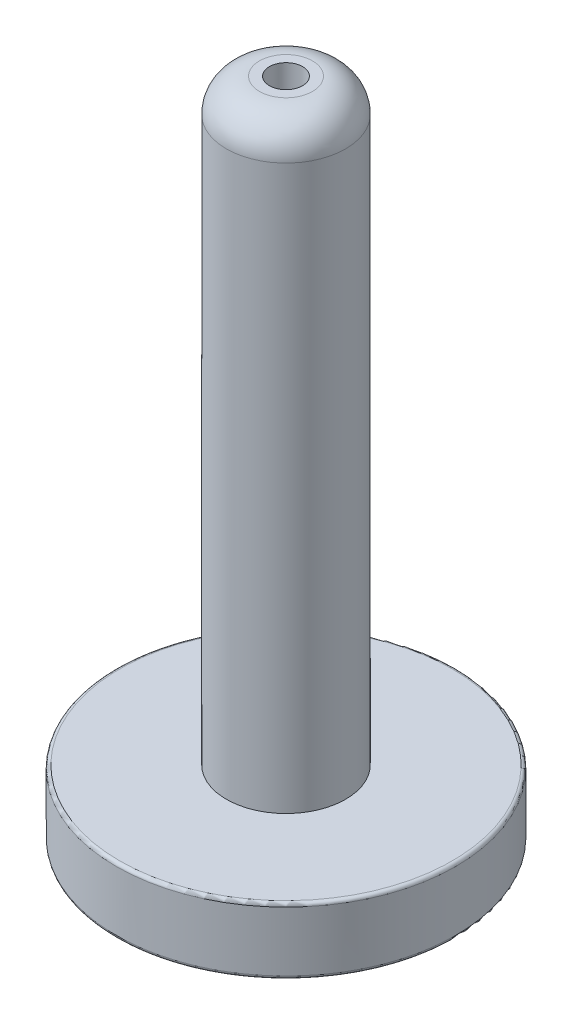
ISO-10303-21;
HEADER;
FILE_DESCRIPTION(('STEP AP214'),'2;1');
FILE_NAME('part.step','',(''),(''),'','','');
FILE_SCHEMA(('AUTOMOTIVE_DESIGN { 1 0 10303 214 1 1 1 1 }'));
ENDSEC;
DATA;
#1=APPLICATION_CONTEXT('core data for automotive mechanical design processes');
#2=APPLICATION_PROTOCOL_DEFINITION('international standard','automotive_design',2000,#1);
#3=PRODUCT_CONTEXT('',#1,'mechanical');
#4=PRODUCT('Part','Part','',(#3));
#5=PRODUCT_RELATED_PRODUCT_CATEGORY('part','',(#4));
#6=PRODUCT_DEFINITION_FORMATION('','',#4);
#7=PRODUCT_DEFINITION_CONTEXT('part definition',#1,'design');
#8=PRODUCT_DEFINITION('design','',#6,#7);
#9=PRODUCT_DEFINITION_SHAPE('','',#8);
#10=(LENGTH_UNIT() NAMED_UNIT(*) SI_UNIT(.MILLI.,.METRE.));
#11=(NAMED_UNIT(*) PLANE_ANGLE_UNIT() SI_UNIT($,.RADIAN.));
#12=(NAMED_UNIT(*) SI_UNIT($,.STERADIAN.) SOLID_ANGLE_UNIT());
#13=UNCERTAINTY_MEASURE_WITH_UNIT(LENGTH_MEASURE(1.E-05),#10,'distance_accuracy_value','');
#14=(GEOMETRIC_REPRESENTATION_CONTEXT(3) GLOBAL_UNCERTAINTY_ASSIGNED_CONTEXT((#13)) GLOBAL_UNIT_ASSIGNED_CONTEXT((#10,
#11,#12)) REPRESENTATION_CONTEXT('',''));
#15=CARTESIAN_POINT('',(0.,0.,0.));
#16=DIRECTION('',(0.,0.,1.));
#17=DIRECTION('',(1.,0.,0.));
#18=AXIS2_PLACEMENT_3D('',#15,#16,#17);
#19=CARTESIAN_POINT('',(9.525,0.,0.));
#20=DIRECTION('',(0.,-1.,0.));
#21=DIRECTION('',(0.,0.,-1.));
#22=AXIS2_PLACEMENT_3D('',#19,#20,#21);
#23=PLANE('',#22);
#24=CARTESIAN_POINT('',(0.,0.,0.));
#25=DIRECTION('',(0.,-1.,0.));
#26=DIRECTION('',(0.,0.,-1.));
#27=AXIS2_PLACEMENT_3D('',#24,#25,#26);
#28=CIRCLE('',#27,31.865000024);
#29=CARTESIAN_POINT('',(0.,0.,-31.865000024));
#30=VERTEX_POINT('',#29);
#31=EDGE_CURVE('E42',#30,#30,#28,.T.);
#32=ORIENTED_EDGE('',*,*,#31,.T.);
#33=EDGE_LOOP('',(#32));
#34=FACE_BOUND('',#33,.T.);
#35=CARTESIAN_POINT('',(0.,0.,0.));
#36=DIRECTION('',(0.,-1.,0.));
#37=DIRECTION('',(0.,0.,-1.));
#38=AXIS2_PLACEMENT_3D('',#35,#36,#37);
#39=CIRCLE('',#38,9.525);
#40=CARTESIAN_POINT('',(0.,0.,-9.525));
#41=VERTEX_POINT('',#40);
#42=EDGE_CURVE('E69',#41,#41,#39,.T.);
#43=ORIENTED_EDGE('',*,*,#42,.F.);
#44=EDGE_LOOP('',(#43));
#45=FACE_BOUND('',#44,.T.);
#46=ADVANCED_FACE('F31',(#34,#45),#23,.T.);
#47=CARTESIAN_POINT('',(0.,0.,0.));
#48=DIRECTION('',(0.,-1.,0.));
#49=DIRECTION('',(0.,0.,-1.));
#50=AXIS2_PLACEMENT_3D('',#47,#48,#49);
#51=CYLINDRICAL_SURFACE('',#50,32.500000024);
#52=CARTESIAN_POINT('',(0.,12.065,0.));
#53=DIRECTION('',(0.,1.,0.));
#54=DIRECTION('',(0.,0.,1.));
#55=AXIS2_PLACEMENT_3D('',#52,#53,#54);
#56=CIRCLE('',#55,32.500000024);
#57=CARTESIAN_POINT('',(0.,12.065,32.500000024));
#58=VERTEX_POINT('',#57);
#59=EDGE_CURVE('E51',#58,#58,#56,.F.);
#60=ORIENTED_EDGE('',*,*,#59,.T.);
#61=EDGE_LOOP('',(#60));
#62=FACE_BOUND('',#61,.T.);
#63=CARTESIAN_POINT('',(0.,0.635,0.));
#64=DIRECTION('',(0.,-1.,0.));
#65=DIRECTION('',(0.,0.,-1.));
#66=AXIS2_PLACEMENT_3D('',#63,#64,#65);
#67=CIRCLE('',#66,32.500000024);
#68=CARTESIAN_POINT('',(0.,0.635,-32.500000024));
#69=VERTEX_POINT('',#68);
#70=EDGE_CURVE('E54',#69,#69,#67,.F.);
#71=ORIENTED_EDGE('',*,*,#70,.T.);
#72=EDGE_LOOP('',(#71));
#73=FACE_BOUND('',#72,.T.);
#74=ADVANCED_FACE('F76',(#62,#73),#51,.T.);
#75=CARTESIAN_POINT('',(32.500000024,12.7,0.));
#76=DIRECTION('',(0.,1.,0.));
#77=DIRECTION('',(0.,0.,1.));
#78=AXIS2_PLACEMENT_3D('',#75,#76,#77);
#79=PLANE('',#78);
#80=CARTESIAN_POINT('',(0.,12.7,0.));
#81=DIRECTION('',(0.,1.,0.));
#82=DIRECTION('',(0.,0.,1.));
#83=AXIS2_PLACEMENT_3D('',#80,#81,#82);
#84=CIRCLE('',#83,31.865000024);
#85=CARTESIAN_POINT('',(0.,12.7,31.865000024));
#86=VERTEX_POINT('',#85);
#87=EDGE_CURVE('E46',#86,#86,#84,.T.);
#88=ORIENTED_EDGE('',*,*,#87,.T.);
#89=EDGE_LOOP('',(#88));
#90=FACE_BOUND('',#89,.T.);
#91=CARTESIAN_POINT('',(0.,12.7,0.));
#92=DIRECTION('',(0.,-1.,0.));
#93=DIRECTION('',(0.,0.,-1.));
#94=AXIS2_PLACEMENT_3D('',#91,#92,#93);
#95=CIRCLE('',#94,11.43);
#96=CARTESIAN_POINT('',(0.,12.7,-11.43));
#97=VERTEX_POINT('',#96);
#98=EDGE_CURVE('E63',#97,#97,#95,.T.);
#99=ORIENTED_EDGE('',*,*,#98,.T.);
#100=EDGE_LOOP('',(#99));
#101=FACE_BOUND('',#100,.T.);
#102=ADVANCED_FACE('F82',(#90,#101),#79,.T.);
#103=CARTESIAN_POINT('',(0.,0.,0.));
#104=DIRECTION('',(0.,-1.,0.));
#105=DIRECTION('',(0.,0.,-1.));
#106=AXIS2_PLACEMENT_3D('',#103,#104,#105);
#107=CYLINDRICAL_SURFACE('',#106,11.43);
#108=CARTESIAN_POINT('',(0.,120.65,0.));
#109=DIRECTION('',(0.,1.,0.));
#110=DIRECTION('',(0.,0.,1.));
#111=AXIS2_PLACEMENT_3D('',#108,#109,#110);
#112=CIRCLE('',#111,11.43);
#113=CARTESIAN_POINT('',(0.,120.65,11.43));
#114=VERTEX_POINT('',#113);
#115=EDGE_CURVE('E60',#114,#114,#112,.F.);
#116=ORIENTED_EDGE('',*,*,#115,.T.);
#117=EDGE_LOOP('',(#116));
#118=FACE_BOUND('',#117,.T.);
#119=ORIENTED_EDGE('',*,*,#98,.F.);
#120=EDGE_LOOP('',(#119));
#121=FACE_BOUND('',#120,.T.);
#122=ADVANCED_FACE('F148',(#118,#121),#107,.T.);
#123=CARTESIAN_POINT('',(11.43,127.,0.));
#124=DIRECTION('',(0.,1.,0.));
#125=DIRECTION('',(0.,0.,1.));
#126=AXIS2_PLACEMENT_3D('',#123,#124,#125);
#127=PLANE('',#126);
#128=CARTESIAN_POINT('',(0.,127.,0.));
#129=DIRECTION('',(0.,1.,0.));
#130=DIRECTION('',(0.,0.,1.));
#131=AXIS2_PLACEMENT_3D('',#128,#129,#130);
#132=CIRCLE('',#131,5.08);
#133=CARTESIAN_POINT('',(0.,127.,5.08));
#134=VERTEX_POINT('',#133);
#135=EDGE_CURVE('E57',#134,#134,#132,.T.);
#136=ORIENTED_EDGE('',*,*,#135,.T.);
#137=EDGE_LOOP('',(#136));
#138=FACE_BOUND('',#137,.T.);
#139=CARTESIAN_POINT('',(0.,127.,0.));
#140=DIRECTION('',(0.,-1.,0.));
#141=DIRECTION('',(0.,0.,-1.));
#142=AXIS2_PLACEMENT_3D('',#139,#140,#141);
#143=CIRCLE('',#142,3.175);
#144=CARTESIAN_POINT('',(0.,127.,-3.175));
#145=VERTEX_POINT('',#144);
#146=EDGE_CURVE('E66',#145,#145,#143,.T.);
#147=ORIENTED_EDGE('',*,*,#146,.T.);
#148=EDGE_LOOP('',(#147));
#149=FACE_BOUND('',#148,.T.);
#150=ADVANCED_FACE('F127',(#138,#149),#127,.T.);
#151=CARTESIAN_POINT('',(0.,0.,0.));
#152=DIRECTION('',(0.,-1.,0.));
#153=DIRECTION('',(0.,0.,-1.));
#154=AXIS2_PLACEMENT_3D('',#151,#152,#153);
#155=CYLINDRICAL_SURFACE('',#154,3.17500000000001);
#156=CARTESIAN_POINT('',(0.,11.6791135768375,0.));
#157=DIRECTION('',(0.,1.,0.));
#158=DIRECTION('',(0.,0.,1.));
#159=AXIS2_PLACEMENT_3D('',#156,#157,#158);
#160=CIRCLE('',#159,3.17500000000001);
#161=CARTESIAN_POINT('',(0.,11.6791135768375,3.17500000000001));
#162=VERTEX_POINT('',#161);
#163=EDGE_CURVE('E38',#162,#162,#160,.F.);
#164=ORIENTED_EDGE('',*,*,#163,.T.);
#165=EDGE_LOOP('',(#164));
#166=FACE_BOUND('',#165,.T.);
#167=ORIENTED_EDGE('',*,*,#146,.F.);
#168=EDGE_LOOP('',(#167));
#169=FACE_BOUND('',#168,.T.);
#170=ADVANCED_FACE('F118',(#166,#169),#155,.F.);
#171=CARTESIAN_POINT('',(0.,10.9985226280624,0.));
#172=DIRECTION('',(0.,-1.,0.));
#173=DIRECTION('',(0.,0.,-1.));
#174=AXIS2_PLACEMENT_3D('',#171,#172,#173);
#175=CONICAL_SURFACE('',#174,3.17500000000001,0.523598775598297);
#176=CARTESIAN_POINT('',(0.,10.4091135768375,0.));
#177=DIRECTION('',(0.,1.,0.));
#178=DIRECTION('',(0.,0.,1.));
#179=AXIS2_PLACEMENT_3D('',#176,#177,#178);
#180=CIRCLE('',#179,3.51529547438753);
#181=CARTESIAN_POINT('',(0.,10.4091135768375,3.51529547438753));
#182=VERTEX_POINT('',#181);
#183=EDGE_CURVE('E10',#182,#182,#180,.T.);
#184=ORIENTED_EDGE('',*,*,#183,.T.);
#185=EDGE_LOOP('',(#184));
#186=FACE_BOUND('',#185,.T.);
#187=ORIENTED_EDGE('',*,*,#42,.T.);
#188=EDGE_LOOP('',(#187));
#189=FACE_BOUND('',#188,.T.);
#190=ADVANCED_FACE('F73',(#186,#189),#175,.F.);
#191=CARTESIAN_POINT('',(0.,120.65,0.));
#192=DIRECTION('',(0.,1.,0.));
#193=DIRECTION('',(0.,0.,1.));
#194=AXIS2_PLACEMENT_3D('',#191,#192,#193);
#195=DEGENERATE_TOROIDAL_SURFACE('',#194,5.08,6.35,.T.);
#196=ORIENTED_EDGE('',*,*,#135,.F.);
#197=EDGE_LOOP('',(#196));
#198=FACE_BOUND('',#197,.T.);
#199=ORIENTED_EDGE('',*,*,#115,.F.);
#200=EDGE_LOOP('',(#199));
#201=FACE_BOUND('',#200,.T.);
#202=ADVANCED_FACE('F87',(#198,#201),#195,.T.);
#203=CARTESIAN_POINT('',(0.,12.065,0.));
#204=DIRECTION('',(0.,1.,0.));
#205=DIRECTION('',(0.,0.,1.));
#206=AXIS2_PLACEMENT_3D('',#203,#204,#205);
#207=TOROIDAL_SURFACE('',#206,31.865000024,0.635);
#208=ORIENTED_EDGE('',*,*,#87,.F.);
#209=EDGE_LOOP('',(#208));
#210=FACE_BOUND('',#209,.T.);
#211=ORIENTED_EDGE('',*,*,#59,.F.);
#212=EDGE_LOOP('',(#211));
#213=FACE_BOUND('',#212,.T.);
#214=ADVANCED_FACE('F90',(#210,#213),#207,.T.);
#215=CARTESIAN_POINT('',(0.,0.635,0.));
#216=DIRECTION('',(0.,-1.,0.));
#217=DIRECTION('',(0.,0.,-1.));
#218=AXIS2_PLACEMENT_3D('',#215,#216,#217);
#219=TOROIDAL_SURFACE('',#218,31.865000024,0.635);
#220=ORIENTED_EDGE('',*,*,#70,.F.);
#221=EDGE_LOOP('',(#220));
#222=FACE_BOUND('',#221,.T.);
#223=ORIENTED_EDGE('',*,*,#31,.F.);
#224=EDGE_LOOP('',(#223));
#225=FACE_BOUND('',#224,.T.);
#226=ADVANCED_FACE('F93',(#222,#225),#219,.T.);
#227=CARTESIAN_POINT('',(0.,11.6791135768375,0.));
#228=DIRECTION('',(0.,1.,0.));
#229=DIRECTION('',(0.,0.,1.));
#230=AXIS2_PLACEMENT_3D('',#227,#228,#229);
#231=TOROIDAL_SURFACE('',#230,5.71500000000001,2.54);
#232=ORIENTED_EDGE('',*,*,#183,.F.);
#233=EDGE_LOOP('',(#232));
#234=FACE_BOUND('',#233,.T.);
#235=ORIENTED_EDGE('',*,*,#163,.F.);
#236=EDGE_LOOP('',(#235));
#237=FACE_BOUND('',#236,.T.);
#238=ADVANCED_FACE('F33',(#234,#237),#231,.T.);
#239=CLOSED_SHELL('',(#46,#74,#102,#122,#150,#170,#190,#202,#214,#226,#238));
#240=MANIFOLD_SOLID_BREP('B2',#239);
#241=ADVANCED_BREP_SHAPE_REPRESENTATION('',(#18,#240),#14);
#242=SHAPE_DEFINITION_REPRESENTATION(#9,#241);
ENDSEC;
END-ISO-10303-21;
